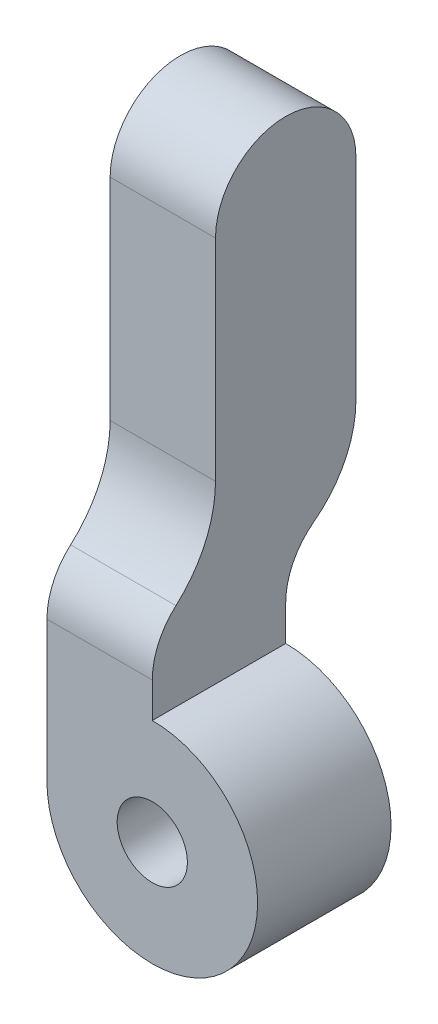
ISO-10303-21;
HEADER;
FILE_DESCRIPTION(('STEP AP214'),'2;1');
FILE_NAME('part.step','',(''),(''),'','','');
FILE_SCHEMA(('AUTOMOTIVE_DESIGN { 1 0 10303 214 1 1 1 1 }'));
ENDSEC;
DATA;
#1=APPLICATION_CONTEXT('core data for automotive mechanical design processes');
#2=APPLICATION_PROTOCOL_DEFINITION('international standard','automotive_design',2000,#1);
#3=PRODUCT_CONTEXT('',#1,'mechanical');
#4=PRODUCT('Part','Part','',(#3));
#5=PRODUCT_RELATED_PRODUCT_CATEGORY('part','',(#4));
#6=PRODUCT_DEFINITION_FORMATION('','',#4);
#7=PRODUCT_DEFINITION_CONTEXT('part definition',#1,'design');
#8=PRODUCT_DEFINITION('design','',#6,#7);
#9=PRODUCT_DEFINITION_SHAPE('','',#8);
#10=(LENGTH_UNIT() NAMED_UNIT(*) SI_UNIT(.MILLI.,.METRE.));
#11=(NAMED_UNIT(*) PLANE_ANGLE_UNIT() SI_UNIT($,.RADIAN.));
#12=(NAMED_UNIT(*) SI_UNIT($,.STERADIAN.) SOLID_ANGLE_UNIT());
#13=UNCERTAINTY_MEASURE_WITH_UNIT(LENGTH_MEASURE(1.E-05),#10,'distance_accuracy_value','');
#14=(GEOMETRIC_REPRESENTATION_CONTEXT(3) GLOBAL_UNCERTAINTY_ASSIGNED_CONTEXT((#13)) GLOBAL_UNIT_ASSIGNED_CONTEXT((#10,
#11,#12)) REPRESENTATION_CONTEXT('',''));
#15=CARTESIAN_POINT('',(0.,0.,0.));
#16=DIRECTION('',(0.,0.,1.));
#17=DIRECTION('',(1.,0.,0.));
#18=AXIS2_PLACEMENT_3D('',#15,#16,#17);
#19=CARTESIAN_POINT('',(0.,0.,1.9));
#20=DIRECTION('',(0.,0.,1.));
#21=DIRECTION('',(1.,0.,0.));
#22=AXIS2_PLACEMENT_3D('',#19,#20,#21);
#23=PLANE('',#22);
#24=DIRECTION('',(0.,-1.,0.));
#25=VECTOR('',#24,1.);
#26=CARTESIAN_POINT('',(-1.5,2.,1.9));
#27=LINE('',#26,#25);
#28=CARTESIAN_POINT('',(-1.5,2.,1.9));
#29=VERTEX_POINT('',#28);
#30=CARTESIAN_POINT('',(-1.5,0.,1.9));
#31=VERTEX_POINT('',#30);
#32=EDGE_CURVE('E58',#29,#31,#27,.T.);
#33=ORIENTED_EDGE('',*,*,#32,.T.);
#34=CARTESIAN_POINT('',(0.,0.,1.9));
#35=DIRECTION('',(0.,0.,1.));
#36=DIRECTION('',(1.,0.,0.));
#37=AXIS2_PLACEMENT_3D('',#34,#35,#36);
#38=CIRCLE('',#37,1.5);
#39=CARTESIAN_POINT('',(0.,1.5,1.9));
#40=VERTEX_POINT('',#39);
#41=EDGE_CURVE('E43',#31,#40,#38,.T.);
#42=ORIENTED_EDGE('',*,*,#41,.T.);
#43=DIRECTION('',(0.,-1.,0.));
#44=VECTOR('',#43,1.);
#45=CARTESIAN_POINT('',(0.,2.,1.9));
#46=LINE('',#45,#44);
#47=CARTESIAN_POINT('',(0.,2.,1.9));
#48=VERTEX_POINT('',#47);
#49=EDGE_CURVE('E115',#48,#40,#46,.T.);
#50=ORIENTED_EDGE('',*,*,#49,.F.);
#51=DIRECTION('',(1.,0.,0.));
#52=VECTOR('',#51,1.);
#53=CARTESIAN_POINT('',(-1.5,2.,1.9));
#54=LINE('',#53,#52);
#55=EDGE_CURVE('E112',#29,#48,#54,.T.);
#56=ORIENTED_EDGE('',*,*,#55,.F.);
#57=EDGE_LOOP('',(#33,#42,#50,#56));
#58=FACE_BOUND('',#57,.T.);
#59=CARTESIAN_POINT('',(0.,0.,1.9));
#60=DIRECTION('',(0.,0.,1.));
#61=DIRECTION('',(1.,0.,0.));
#62=AXIS2_PLACEMENT_3D('',#59,#60,#61);
#63=CIRCLE('',#62,0.5);
#64=CARTESIAN_POINT('',(0.5,0.,1.9));
#65=VERTEX_POINT('',#64);
#66=EDGE_CURVE('E189',#65,#65,#63,.T.);
#67=ORIENTED_EDGE('',*,*,#66,.F.);
#68=EDGE_LOOP('',(#67));
#69=FACE_BOUND('',#68,.T.);
#70=ADVANCED_FACE('F35',(#58,#69),#23,.T.);
#71=CARTESIAN_POINT('',(0.,0.,0.));
#72=DIRECTION('',(0.,0.,1.));
#73=DIRECTION('',(1.,0.,0.));
#74=AXIS2_PLACEMENT_3D('',#71,#72,#73);
#75=PLANE('',#74);
#76=CARTESIAN_POINT('',(0.,0.,0.));
#77=DIRECTION('',(0.,0.,1.));
#78=DIRECTION('',(1.,0.,0.));
#79=AXIS2_PLACEMENT_3D('',#76,#77,#78);
#80=CIRCLE('',#79,1.5);
#81=CARTESIAN_POINT('',(-1.5,0.,0.));
#82=VERTEX_POINT('',#81);
#83=CARTESIAN_POINT('',(0.,1.5,0.));
#84=VERTEX_POINT('',#83);
#85=EDGE_CURVE('E192',#82,#84,#80,.T.);
#86=ORIENTED_EDGE('',*,*,#85,.F.);
#87=DIRECTION('',(0.,1.,0.));
#88=VECTOR('',#87,1.);
#89=CARTESIAN_POINT('',(-1.5,2.,0.));
#90=LINE('',#89,#88);
#91=CARTESIAN_POINT('',(-1.5,2.,0.));
#92=VERTEX_POINT('',#91);
#93=EDGE_CURVE('E50',#82,#92,#90,.T.);
#94=ORIENTED_EDGE('',*,*,#93,.T.);
#95=DIRECTION('',(1.,0.,0.));
#96=VECTOR('',#95,1.);
#97=CARTESIAN_POINT('',(-1.5,2.,0.));
#98=LINE('',#97,#96);
#99=CARTESIAN_POINT('',(0.,2.,0.));
#100=VERTEX_POINT('',#99);
#101=EDGE_CURVE('E120',#92,#100,#98,.T.);
#102=ORIENTED_EDGE('',*,*,#101,.T.);
#103=DIRECTION('',(0.,1.,0.));
#104=VECTOR('',#103,1.);
#105=CARTESIAN_POINT('',(0.,2.,0.));
#106=LINE('',#105,#104);
#107=EDGE_CURVE('E159',#84,#100,#106,.T.);
#108=ORIENTED_EDGE('',*,*,#107,.F.);
#109=EDGE_LOOP('',(#86,#94,#102,#108));
#110=FACE_BOUND('',#109,.T.);
#111=CARTESIAN_POINT('',(0.,0.,0.));
#112=DIRECTION('',(0.,0.,1.));
#113=DIRECTION('',(1.,0.,0.));
#114=AXIS2_PLACEMENT_3D('',#111,#112,#113);
#115=CIRCLE('',#114,0.5);
#116=CARTESIAN_POINT('',(0.5,0.,0.));
#117=VERTEX_POINT('',#116);
#118=EDGE_CURVE('E176',#117,#117,#115,.T.);
#119=ORIENTED_EDGE('',*,*,#118,.T.);
#120=EDGE_LOOP('',(#119));
#121=FACE_BOUND('',#120,.T.);
#122=ADVANCED_FACE('F202',(#110,#121),#75,.F.);
#123=CARTESIAN_POINT('',(0.,0.,1.9));
#124=DIRECTION('',(0.,0.,-1.));
#125=DIRECTION('',(-1.,0.,0.));
#126=AXIS2_PLACEMENT_3D('',#123,#124,#125);
#127=CYLINDRICAL_SURFACE('',#126,1.5);
#128=ORIENTED_EDGE('',*,*,#41,.F.);
#129=DIRECTION('',(0.,0.,1.));
#130=VECTOR('',#129,1.);
#131=CARTESIAN_POINT('',(-1.5,0.,-1.07046626931928));
#132=LINE('',#131,#130);
#133=EDGE_CURVE('E128',#82,#31,#132,.T.);
#134=ORIENTED_EDGE('',*,*,#133,.F.);
#135=ORIENTED_EDGE('',*,*,#85,.T.);
#136=DIRECTION('',(0.,0.,-1.));
#137=VECTOR('',#136,1.);
#138=CARTESIAN_POINT('',(0.,1.5,1.9));
#139=LINE('',#138,#137);
#140=EDGE_CURVE('E11',#40,#84,#139,.T.);
#141=ORIENTED_EDGE('',*,*,#140,.F.);
#142=EDGE_LOOP('',(#128,#134,#135,#141));
#143=FACE_BOUND('',#142,.T.);
#144=ADVANCED_FACE('F37',(#143),#127,.T.);
#145=CARTESIAN_POINT('',(0.,0.,1.9));
#146=DIRECTION('',(0.,0.,-1.));
#147=DIRECTION('',(-1.,0.,0.));
#148=AXIS2_PLACEMENT_3D('',#145,#146,#147);
#149=CYLINDRICAL_SURFACE('',#148,0.5);
#150=ORIENTED_EDGE('',*,*,#66,.T.);
#151=EDGE_LOOP('',(#150));
#152=FACE_BOUND('',#151,.T.);
#153=ORIENTED_EDGE('',*,*,#118,.F.);
#154=EDGE_LOOP('',(#153));
#155=FACE_BOUND('',#154,.T.);
#156=ADVANCED_FACE('F240',(#152,#155),#149,.F.);
#157=CARTESIAN_POINT('',(0.,2.,0.9));
#158=DIRECTION('',(-1.,0.,0.));
#159=DIRECTION('',(0.,0.,1.));
#160=AXIS2_PLACEMENT_3D('',#157,#158,#159);
#161=PLANE('',#160);
#162=ORIENTED_EDGE('',*,*,#49,.T.);
#163=ORIENTED_EDGE('',*,*,#140,.T.);
#164=ORIENTED_EDGE('',*,*,#107,.T.);
#165=CARTESIAN_POINT('',(0.,2.,-1.));
#166=DIRECTION('',(-1.,0.,0.));
#167=DIRECTION('',(0.,0.,1.));
#168=AXIS2_PLACEMENT_3D('',#165,#166,#167);
#169=CIRCLE('',#168,1.);
#170=CARTESIAN_POINT('',(0.,2.8,-0.4));
#171=VERTEX_POINT('',#170);
#172=EDGE_CURVE('E161',#100,#171,#169,.T.);
#173=ORIENTED_EDGE('',*,*,#172,.T.);
#174=CARTESIAN_POINT('',(0.,4.,0.5));
#175=DIRECTION('',(1.,0.,0.));
#176=DIRECTION('',(0.,0.,1.));
#177=AXIS2_PLACEMENT_3D('',#174,#175,#176);
#178=CIRCLE('',#177,1.5);
#179=CARTESIAN_POINT('',(0.,4.,-1.));
#180=VERTEX_POINT('',#179);
#181=EDGE_CURVE('E164',#171,#180,#178,.T.);
#182=ORIENTED_EDGE('',*,*,#181,.T.);
#183=DIRECTION('',(0.,1.,0.));
#184=VECTOR('',#183,1.);
#185=CARTESIAN_POINT('',(0.,7.,-1.));
#186=LINE('',#185,#184);
#187=CARTESIAN_POINT('',(0.,7.,-1.));
#188=VERTEX_POINT('',#187);
#189=EDGE_CURVE('E167',#180,#188,#186,.T.);
#190=ORIENTED_EDGE('',*,*,#189,.T.);
#191=CARTESIAN_POINT('',(0.,7.,0.));
#192=DIRECTION('',(1.,0.,0.));
#193=DIRECTION('',(0.,0.,1.));
#194=AXIS2_PLACEMENT_3D('',#191,#192,#193);
#195=CIRCLE('',#194,1.);
#196=CARTESIAN_POINT('',(0.,7.,0.999999999999999));
#197=VERTEX_POINT('',#196);
#198=EDGE_CURVE('E170',#188,#197,#195,.T.);
#199=ORIENTED_EDGE('',*,*,#198,.T.);
#200=DIRECTION('',(0.,-1.,0.));
#201=VECTOR('',#200,1.);
#202=CARTESIAN_POINT('',(0.,4.,1.));
#203=LINE('',#202,#201);
#204=CARTESIAN_POINT('',(0.,4.,1.));
#205=VERTEX_POINT('',#204);
#206=EDGE_CURVE('E135',#197,#205,#203,.T.);
#207=ORIENTED_EDGE('',*,*,#206,.T.);
#208=CARTESIAN_POINT('',(0.,4.,2.67222222222222));
#209=DIRECTION('',(-1.,0.,0.));
#210=DIRECTION('',(0.,0.,-1.));
#211=AXIS2_PLACEMENT_3D('',#208,#209,#210);
#212=CIRCLE('',#211,1.67222222222222);
#213=CARTESIAN_POINT('',(0.,2.74844074844075,1.56320166320166));
#214=VERTEX_POINT('',#213);
#215=EDGE_CURVE('E132',#205,#214,#212,.T.);
#216=ORIENTED_EDGE('',*,*,#215,.T.);
#217=CARTESIAN_POINT('',(0.,2.,0.9));
#218=DIRECTION('',(1.,0.,0.));
#219=DIRECTION('',(0.,0.,1.));
#220=AXIS2_PLACEMENT_3D('',#217,#218,#219);
#221=CIRCLE('',#220,1.);
#222=EDGE_CURVE('E156',#214,#48,#221,.T.);
#223=ORIENTED_EDGE('',*,*,#222,.T.);
#224=EDGE_LOOP('',(#162,#163,#164,#173,#182,#190,#199,#207,#216,#223));
#225=FACE_BOUND('',#224,.T.);
#226=ADVANCED_FACE('F201',(#225),#161,.F.);
#227=CARTESIAN_POINT('',(-1.5,2.,0.9));
#228=DIRECTION('',(1.,0.,0.));
#229=DIRECTION('',(0.,0.,-1.));
#230=AXIS2_PLACEMENT_3D('',#227,#228,#229);
#231=CYLINDRICAL_SURFACE('',#230,1.);
#232=ORIENTED_EDGE('',*,*,#222,.F.);
#233=DIRECTION('',(1.,0.,0.));
#234=VECTOR('',#233,1.);
#235=CARTESIAN_POINT('',(-1.5,2.74844074844075,1.56320166320166));
#236=LINE('',#235,#234);
#237=CARTESIAN_POINT('',(-1.5,2.74844074844075,1.56320166320166));
#238=VERTEX_POINT('',#237);
#239=EDGE_CURVE('E131',#238,#214,#236,.T.);
#240=ORIENTED_EDGE('',*,*,#239,.F.);
#241=CARTESIAN_POINT('',(-1.5,2.,0.9));
#242=DIRECTION('',(1.,0.,0.));
#243=DIRECTION('',(0.,0.,1.));
#244=AXIS2_PLACEMENT_3D('',#241,#242,#243);
#245=CIRCLE('',#244,1.);
#246=EDGE_CURVE('E126',#238,#29,#245,.T.);
#247=ORIENTED_EDGE('',*,*,#246,.T.);
#248=ORIENTED_EDGE('',*,*,#55,.T.);
#249=EDGE_LOOP('',(#232,#240,#247,#248));
#250=FACE_BOUND('',#249,.T.);
#251=ADVANCED_FACE('F130',(#250),#231,.T.);
#252=CARTESIAN_POINT('',(-1.5,4.,2.67222222222222));
#253=DIRECTION('',(1.,0.,0.));
#254=DIRECTION('',(0.,0.,-1.));
#255=AXIS2_PLACEMENT_3D('',#252,#253,#254);
#256=CYLINDRICAL_SURFACE('',#255,1.67222222222222);
#257=ORIENTED_EDGE('',*,*,#215,.F.);
#258=DIRECTION('',(1.,0.,0.));
#259=VECTOR('',#258,1.);
#260=CARTESIAN_POINT('',(-1.5,4.,1.));
#261=LINE('',#260,#259);
#262=CARTESIAN_POINT('',(-1.5,4.,1.));
#263=VERTEX_POINT('',#262);
#264=EDGE_CURVE('E177',#263,#205,#261,.T.);
#265=ORIENTED_EDGE('',*,*,#264,.F.);
#266=CARTESIAN_POINT('',(-1.5,4.,2.67222222222222));
#267=DIRECTION('',(-1.,0.,0.));
#268=DIRECTION('',(0.,0.,-1.));
#269=AXIS2_PLACEMENT_3D('',#266,#267,#268);
#270=CIRCLE('',#269,1.67222222222222);
#271=EDGE_CURVE('E121',#263,#238,#270,.T.);
#272=ORIENTED_EDGE('',*,*,#271,.T.);
#273=ORIENTED_EDGE('',*,*,#239,.T.);
#274=EDGE_LOOP('',(#257,#265,#272,#273));
#275=FACE_BOUND('',#274,.T.);
#276=ADVANCED_FACE('F223',(#275),#256,.F.);
#277=CARTESIAN_POINT('',(-1.5,4.,1.));
#278=DIRECTION('',(0.,0.,1.));
#279=DIRECTION('',(1.,0.,0.));
#280=AXIS2_PLACEMENT_3D('',#277,#278,#279);
#281=PLANE('',#280);
#282=ORIENTED_EDGE('',*,*,#206,.F.);
#283=DIRECTION('',(1.,0.,0.));
#284=VECTOR('',#283,1.);
#285=CARTESIAN_POINT('',(-1.5,7.,0.999999999999999));
#286=LINE('',#285,#284);
#287=CARTESIAN_POINT('',(-1.5,7.,0.999999999999999));
#288=VERTEX_POINT('',#287);
#289=EDGE_CURVE('E179',#288,#197,#286,.T.);
#290=ORIENTED_EDGE('',*,*,#289,.F.);
#291=DIRECTION('',(0.,-1.,0.));
#292=VECTOR('',#291,1.);
#293=CARTESIAN_POINT('',(-1.5,4.,1.));
#294=LINE('',#293,#292);
#295=EDGE_CURVE('E152',#288,#263,#294,.T.);
#296=ORIENTED_EDGE('',*,*,#295,.T.);
#297=ORIENTED_EDGE('',*,*,#264,.T.);
#298=EDGE_LOOP('',(#282,#290,#296,#297));
#299=FACE_BOUND('',#298,.T.);
#300=ADVANCED_FACE('F225',(#299),#281,.T.);
#301=CARTESIAN_POINT('',(-1.5,7.,0.));
#302=DIRECTION('',(1.,0.,0.));
#303=DIRECTION('',(0.,0.,-1.));
#304=AXIS2_PLACEMENT_3D('',#301,#302,#303);
#305=CYLINDRICAL_SURFACE('',#304,1.);
#306=ORIENTED_EDGE('',*,*,#198,.F.);
#307=DIRECTION('',(1.,0.,0.));
#308=VECTOR('',#307,1.);
#309=CARTESIAN_POINT('',(-1.5,7.,-1.));
#310=LINE('',#309,#308);
#311=CARTESIAN_POINT('',(-1.5,7.,-1.));
#312=VERTEX_POINT('',#311);
#313=EDGE_CURVE('E181',#312,#188,#310,.T.);
#314=ORIENTED_EDGE('',*,*,#313,.F.);
#315=CARTESIAN_POINT('',(-1.5,7.,0.));
#316=DIRECTION('',(1.,0.,0.));
#317=DIRECTION('',(0.,0.,1.));
#318=AXIS2_PLACEMENT_3D('',#315,#316,#317);
#319=CIRCLE('',#318,1.);
#320=EDGE_CURVE('E149',#312,#288,#319,.T.);
#321=ORIENTED_EDGE('',*,*,#320,.T.);
#322=ORIENTED_EDGE('',*,*,#289,.T.);
#323=EDGE_LOOP('',(#306,#314,#321,#322));
#324=FACE_BOUND('',#323,.T.);
#325=ADVANCED_FACE('F218',(#324),#305,.T.);
#326=CARTESIAN_POINT('',(-1.5,7.,-1.));
#327=DIRECTION('',(0.,0.,-1.));
#328=DIRECTION('',(0.,1.,0.));
#329=AXIS2_PLACEMENT_3D('',#326,#327,#328);
#330=PLANE('',#329);
#331=ORIENTED_EDGE('',*,*,#189,.F.);
#332=DIRECTION('',(1.,0.,0.));
#333=VECTOR('',#332,1.);
#334=CARTESIAN_POINT('',(-1.5,4.,-1.));
#335=LINE('',#334,#333);
#336=CARTESIAN_POINT('',(-1.5,4.,-1.));
#337=VERTEX_POINT('',#336);
#338=EDGE_CURVE('E183',#337,#180,#335,.T.);
#339=ORIENTED_EDGE('',*,*,#338,.F.);
#340=DIRECTION('',(0.,1.,0.));
#341=VECTOR('',#340,1.);
#342=CARTESIAN_POINT('',(-1.5,7.,-1.));
#343=LINE('',#342,#341);
#344=EDGE_CURVE('E146',#337,#312,#343,.T.);
#345=ORIENTED_EDGE('',*,*,#344,.T.);
#346=ORIENTED_EDGE('',*,*,#313,.T.);
#347=EDGE_LOOP('',(#331,#339,#345,#346));
#348=FACE_BOUND('',#347,.T.);
#349=ADVANCED_FACE('F214',(#348),#330,.T.);
#350=CARTESIAN_POINT('',(-1.5,4.,0.5));
#351=DIRECTION('',(1.,0.,0.));
#352=DIRECTION('',(0.,0.,-1.));
#353=AXIS2_PLACEMENT_3D('',#350,#351,#352);
#354=CYLINDRICAL_SURFACE('',#353,1.5);
#355=ORIENTED_EDGE('',*,*,#181,.F.);
#356=DIRECTION('',(1.,0.,0.));
#357=VECTOR('',#356,1.);
#358=CARTESIAN_POINT('',(-1.5,2.8,-0.4));
#359=LINE('',#358,#357);
#360=CARTESIAN_POINT('',(-1.5,2.8,-0.4));
#361=VERTEX_POINT('',#360);
#362=EDGE_CURVE('E185',#361,#171,#359,.T.);
#363=ORIENTED_EDGE('',*,*,#362,.F.);
#364=CARTESIAN_POINT('',(-1.5,4.,0.5));
#365=DIRECTION('',(1.,0.,0.));
#366=DIRECTION('',(0.,0.,1.));
#367=AXIS2_PLACEMENT_3D('',#364,#365,#366);
#368=CIRCLE('',#367,1.5);
#369=EDGE_CURVE('E143',#361,#337,#368,.T.);
#370=ORIENTED_EDGE('',*,*,#369,.T.);
#371=ORIENTED_EDGE('',*,*,#338,.T.);
#372=EDGE_LOOP('',(#355,#363,#370,#371));
#373=FACE_BOUND('',#372,.T.);
#374=ADVANCED_FACE('F210',(#373),#354,.T.);
#375=CARTESIAN_POINT('',(-1.5,2.,-1.));
#376=DIRECTION('',(1.,0.,0.));
#377=DIRECTION('',(0.,0.,-1.));
#378=AXIS2_PLACEMENT_3D('',#375,#376,#377);
#379=CYLINDRICAL_SURFACE('',#378,1.);
#380=ORIENTED_EDGE('',*,*,#172,.F.);
#381=ORIENTED_EDGE('',*,*,#101,.F.);
#382=CARTESIAN_POINT('',(-1.5,2.,-1.));
#383=DIRECTION('',(-1.,0.,0.));
#384=DIRECTION('',(0.,0.,1.));
#385=AXIS2_PLACEMENT_3D('',#382,#383,#384);
#386=CIRCLE('',#385,1.);
#387=EDGE_CURVE('E140',#92,#361,#386,.T.);
#388=ORIENTED_EDGE('',*,*,#387,.T.);
#389=ORIENTED_EDGE('',*,*,#362,.T.);
#390=EDGE_LOOP('',(#380,#381,#388,#389));
#391=FACE_BOUND('',#390,.T.);
#392=ADVANCED_FACE('F206',(#391),#379,.F.);
#393=CARTESIAN_POINT('',(-1.5,2.,0.9));
#394=DIRECTION('',(-1.,0.,0.));
#395=DIRECTION('',(0.,0.,1.));
#396=AXIS2_PLACEMENT_3D('',#393,#394,#395);
#397=PLANE('',#396);
#398=ORIENTED_EDGE('',*,*,#246,.F.);
#399=ORIENTED_EDGE('',*,*,#271,.F.);
#400=ORIENTED_EDGE('',*,*,#295,.F.);
#401=ORIENTED_EDGE('',*,*,#320,.F.);
#402=ORIENTED_EDGE('',*,*,#344,.F.);
#403=ORIENTED_EDGE('',*,*,#369,.F.);
#404=ORIENTED_EDGE('',*,*,#387,.F.);
#405=ORIENTED_EDGE('',*,*,#93,.F.);
#406=ORIENTED_EDGE('',*,*,#133,.T.);
#407=ORIENTED_EDGE('',*,*,#32,.F.);
#408=EDGE_LOOP('',(#398,#399,#400,#401,#402,#403,#404,#405,#406,#407));
#409=FACE_BOUND('',#408,.T.);
#410=ADVANCED_FACE('F124',(#409),#397,.T.);
#411=CLOSED_SHELL('',(#70,#122,#144,#156,#226,#251,#276,#300,#325,#349,#374,#392,#410));
#412=MANIFOLD_SOLID_BREP('B2',#411);
#413=ADVANCED_BREP_SHAPE_REPRESENTATION('',(#18,#412),#14);
#414=SHAPE_DEFINITION_REPRESENTATION(#9,#413);
ENDSEC;
END-ISO-10303-21;
